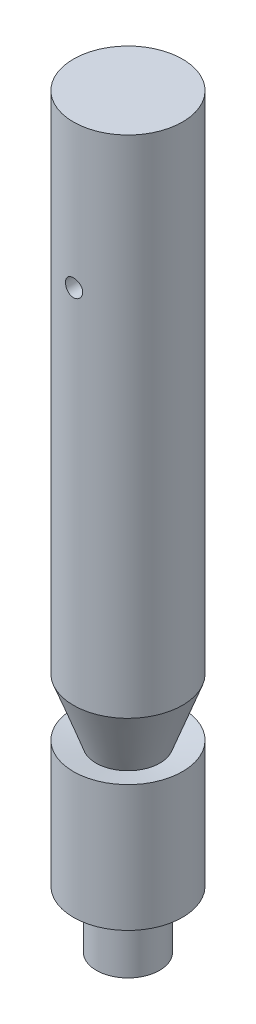
ISO-10303-21;
HEADER;
FILE_DESCRIPTION(('STEP AP214'),'2;1');
FILE_NAME('part.step','',(''),(''),'','','');
FILE_SCHEMA(('AUTOMOTIVE_DESIGN { 1 0 10303 214 1 1 1 1 }'));
ENDSEC;
DATA;
#1=APPLICATION_CONTEXT('core data for automotive mechanical design processes');
#2=APPLICATION_PROTOCOL_DEFINITION('international standard','automotive_design',2000,#1);
#3=PRODUCT_CONTEXT('',#1,'mechanical');
#4=PRODUCT('Part','Part','',(#3));
#5=PRODUCT_RELATED_PRODUCT_CATEGORY('part','',(#4));
#6=PRODUCT_DEFINITION_FORMATION('','',#4);
#7=PRODUCT_DEFINITION_CONTEXT('part definition',#1,'design');
#8=PRODUCT_DEFINITION('design','',#6,#7);
#9=PRODUCT_DEFINITION_SHAPE('','',#8);
#10=(LENGTH_UNIT() NAMED_UNIT(*) SI_UNIT(.MILLI.,.METRE.));
#11=(NAMED_UNIT(*) PLANE_ANGLE_UNIT() SI_UNIT($,.RADIAN.));
#12=(NAMED_UNIT(*) SI_UNIT($,.STERADIAN.) SOLID_ANGLE_UNIT());
#13=UNCERTAINTY_MEASURE_WITH_UNIT(LENGTH_MEASURE(1.E-05),#10,'distance_accuracy_value','');
#14=(GEOMETRIC_REPRESENTATION_CONTEXT(3) GLOBAL_UNCERTAINTY_ASSIGNED_CONTEXT((#13)) GLOBAL_UNIT_ASSIGNED_CONTEXT((#10,
#11,#12)) REPRESENTATION_CONTEXT('',''));
#15=CARTESIAN_POINT('',(0.,0.,0.));
#16=DIRECTION('',(0.,0.,1.));
#17=DIRECTION('',(1.,0.,0.));
#18=AXIS2_PLACEMENT_3D('',#15,#16,#17);
#19=CARTESIAN_POINT('',(0.,120.,0.));
#20=DIRECTION('',(0.,-1.,0.));
#21=DIRECTION('',(0.,0.,-1.));
#22=AXIS2_PLACEMENT_3D('',#19,#20,#21);
#23=CYLINDRICAL_SURFACE('',#22,9.5);
#24=CARTESIAN_POINT('',(0.,32.,0.));
#25=DIRECTION('',(0.,1.,0.));
#26=DIRECTION('',(0.,0.,1.));
#27=AXIS2_PLACEMENT_3D('',#24,#25,#26);
#28=CIRCLE('',#27,9.5);
#29=CARTESIAN_POINT('',(0.,32.,9.5));
#30=VERTEX_POINT('',#29);
#31=EDGE_CURVE('E62',#30,#30,#28,.T.);
#32=ORIENTED_EDGE('',*,*,#31,.T.);
#33=EDGE_LOOP('',(#32));
#34=FACE_BOUND('',#33,.T.);
#35=CARTESIAN_POINT('',(0.,120.,0.));
#36=DIRECTION('',(0.,1.,0.));
#37=DIRECTION('',(0.,0.,1.));
#38=AXIS2_PLACEMENT_3D('',#35,#36,#37);
#39=CIRCLE('',#38,9.5);
#40=CARTESIAN_POINT('',(0.,120.,9.5));
#41=VERTEX_POINT('',#40);
#42=EDGE_CURVE('E48',#41,#41,#39,.T.);
#43=ORIENTED_EDGE('',*,*,#42,.F.);
#44=EDGE_LOOP('',(#43));
#45=FACE_BOUND('',#44,.T.);
#46=CARTESIAN_POINT('',(-1.5,95.,9.38083151964686));
#47=CARTESIAN_POINT('',(-1.49999658455056,94.916309730994,9.38083297404067));
#48=CARTESIAN_POINT('',(-1.49297223784084,94.8325722057604,9.38196360092028));
#49=CARTESIAN_POINT('',(-1.46507009131938,94.6674421963071,9.38636039550341));
#50=CARTESIAN_POINT('',(-1.44417911871311,94.5860520187702,9.38962859377943));
#51=CARTESIAN_POINT('',(-1.38918760267279,94.4280306268152,9.39792135372632));
#52=CARTESIAN_POINT('',(-1.35509761216466,94.3513956671386,9.40294451195283));
#53=CARTESIAN_POINT('',(-1.27470128030859,94.2049430897645,9.414179545352));
#54=CARTESIAN_POINT('',(-1.22839647880733,94.1351246142734,9.42039127066217));
#55=CARTESIAN_POINT('',(-1.12444713836387,94.0036587559128,9.43336503838525));
#56=CARTESIAN_POINT('',(-1.06671563821398,93.9420805156865,9.44013105201472));
#57=CARTESIAN_POINT('',(-0.941739545888727,93.8294429254274,9.45341567106039));
#58=CARTESIAN_POINT('',(-0.874494412511281,93.7783841742228,9.45993426237471));
#59=CARTESIAN_POINT('',(-0.731954548292167,93.6879777440354,9.47203134599669));
#60=CARTESIAN_POINT('',(-0.656618750818363,93.6486940570074,9.47760463238818));
#61=CARTESIAN_POINT('',(-0.500315336961975,93.5833638343747,9.48713906529767));
#62=CARTESIAN_POINT('',(-0.419348049999347,93.5573165252331,9.49110030602129));
#63=CARTESIAN_POINT('',(-0.254793214503934,93.5194089321868,9.49693629805995));
#64=CARTESIAN_POINT('',(-0.171232996932503,93.5074326731839,9.4988280968723));
#65=CARTESIAN_POINT('',(-0.00326909893889383,93.4976467905348,9.5003705446193));
#66=CARTESIAN_POINT('',(0.0811345294603275,93.499836298441,9.50002133094165));
#67=CARTESIAN_POINT('',(0.247597304848638,93.5182287718207,9.49713466336619));
#68=CARTESIAN_POINT('',(0.329670625893898,93.5343069477594,9.49461669627846));
#69=CARTESIAN_POINT('',(0.489939598315297,93.5798241916706,9.48769715323518));
#70=CARTESIAN_POINT('',(0.568135141212462,93.6092636331844,9.48329552461823));
#71=CARTESIAN_POINT('',(0.718803540216118,93.6807937561529,9.47306987014885));
#72=CARTESIAN_POINT('',(0.791251288178856,93.7229364571255,9.46724001448607));
#73=CARTESIAN_POINT('',(0.928093849593964,93.8186387835267,9.45480671150477));
#74=CARTESIAN_POINT('',(0.992488076174234,93.872199240216,9.44820320787719));
#75=CARTESIAN_POINT('',(1.1121320674923,93.989910476114,9.43487320037046));
#76=CARTESIAN_POINT('',(1.16727457805414,94.0541702627698,9.42814614020982));
#77=CARTESIAN_POINT('',(1.26601092962899,94.1910871241671,9.41539709463343));
#78=CARTESIAN_POINT('',(1.30960468415935,94.2637442617862,9.40937511449785));
#79=CARTESIAN_POINT('',(1.38402357522716,94.4155109464371,9.39871800561222));
#80=CARTESIAN_POINT('',(1.41483681797789,94.4946264221589,9.3940841698043));
#81=CARTESIAN_POINT('',(1.46270749784294,94.6569994205907,9.38675017598398));
#82=CARTESIAN_POINT('',(1.47976601505946,94.7402566175231,9.38404986614159));
#83=CARTESIAN_POINT('',(1.49949411042943,94.9075929556589,9.38091773533559));
#84=CARTESIAN_POINT('',(1.50231612080203,94.9916536912182,9.38046188392375));
#85=CARTESIAN_POINT('',(1.4938963689811,95.1590470589331,9.38180638869071));
#86=CARTESIAN_POINT('',(1.48265509215639,95.2423797161168,9.38360666700331));
#87=CARTESIAN_POINT('',(1.44655746438407,95.4054736693627,9.38923845197488));
#88=CARTESIAN_POINT('',(1.42177781446732,95.4852523717135,9.39305851175888));
#89=CARTESIAN_POINT('',(1.35938693205191,95.6395243407161,9.4022899197254));
#90=CARTESIAN_POINT('',(1.3217750034913,95.7140173203894,9.40770135422673));
#91=CARTESIAN_POINT('',(1.23442398163625,95.856284315317,9.41956203589073));
#92=CARTESIAN_POINT('',(1.18458667109844,95.9239973256054,9.42601953670219));
#93=CARTESIAN_POINT('',(1.07433532022963,96.0501534885926,9.43922022959442));
#94=CARTESIAN_POINT('',(1.01392061491124,96.10859605803,9.44596343961713));
#95=CARTESIAN_POINT('',(0.883556250112778,96.2151040379333,9.45905128553892));
#96=CARTESIAN_POINT('',(0.813523322567928,96.2630681337632,9.46539164279549));
#97=CARTESIAN_POINT('',(0.666305394879817,96.3465500312293,9.47689193046182));
#98=CARTESIAN_POINT('',(0.589120607345009,96.3820682027044,9.48205189594613));
#99=CARTESIAN_POINT('',(0.430099180755792,96.439490080176,9.49059133505206));
#100=CARTESIAN_POINT('',(0.348282544696109,96.4614480818955,9.49397790107198));
#101=CARTESIAN_POINT('',(0.18206554100052,96.4913016379704,9.49861883842448));
#102=CARTESIAN_POINT('',(0.0976653637496311,96.4991982260071,9.49987336648691));
#103=CARTESIAN_POINT('',(-0.0703424890561692,96.5006774861193,9.50010700904781));
#104=CARTESIAN_POINT('',(-0.153948809855684,96.4944147738016,9.49911070212592));
#105=CARTESIAN_POINT('',(-0.318903288593769,96.468086009826,9.49500446266303));
#106=CARTESIAN_POINT('',(-0.400251456141506,96.4480200169149,9.4918945391176));
#107=CARTESIAN_POINT('',(-0.558330315524416,96.3947112386408,9.48390902705529));
#108=CARTESIAN_POINT('',(-0.635065084473802,96.3614802910505,9.47903502511628));
#109=CARTESIAN_POINT('',(-0.781893871437123,96.2828017130742,9.46805518209959));
#110=CARTESIAN_POINT('',(-0.851987627392476,96.2373536008625,9.46194929244058));
#111=CARTESIAN_POINT('',(-0.984326499290176,96.1349767236385,9.44910438099924));
#112=CARTESIAN_POINT('',(-1.04648306132953,96.0779342156682,9.44235947063351));
#113=CARTESIAN_POINT('',(-1.16039729972464,95.9542269669354,9.42903896923987));
#114=CARTESIAN_POINT('',(-1.21215253557012,95.887559974227,9.42246341826432));
#115=CARTESIAN_POINT('',(-1.30409009743287,95.7460015685182,9.4101817273596));
#116=CARTESIAN_POINT('',(-1.34419772972857,95.671061150686,9.40448130469082));
#117=CARTESIAN_POINT('',(-1.41119529560835,95.5154502477483,9.39466254048804));
#118=CARTESIAN_POINT('',(-1.43809871074204,95.434785703743,9.39054258623338));
#119=CARTESIAN_POINT('',(-1.47193913254667,95.2948171282112,9.38528558640041));
#120=CARTESIAN_POINT('',(-1.48244550005068,95.2363700340157,9.38362436450214));
#121=CARTESIAN_POINT('',(-1.49647709113172,95.1186231993665,9.38139682399235));
#122=CARTESIAN_POINT('',(-1.50000242102603,95.0593234719117,9.38083048870633));
#123=CARTESIAN_POINT('',(-1.5,95.,9.38083151964686));
#124=B_SPLINE_CURVE_WITH_KNOTS('',3,(#46,#47,#48,#49,#50,#51,#52,#53,#54,#55,#56,#57,#58,#59,
#60,#61,#62,#63,#64,#65,#66,#67,#68,#69,#70,#71,#72,#73,#74,#75,#76,#77,#78,#79,#80,#81,#82,#83,
#84,#85,#86,#87,#88,#89,#90,#91,#92,#93,#94,#95,#96,#97,#98,#99,#100,#101,#102,#103,#104,#105,
#106,#107,#108,#109,#110,#111,#112,#113,#114,#115,#116,#117,#118,#119,#120,#121,#122,#123),
.UNSPECIFIED.,.T.,.F.,(4,2,2,2,2,2,2,2,2,2,2,2,2,2,2,2,2,2,2,2,2,2,2,2,2,2,2,2,2,2,2,2,2,2,2,2,
2,2,4),(0.,0.250853927262175,0.501946498416266,0.752838728320962,1.00369934487582,
1.2565480788977,1.50941120251429,1.76362459165416,2.01782312279828,2.26991148848838,
2.52198439977627,2.77181572176523,3.02165402872708,3.27252964579772,3.52342353390932,
3.77705047333307,4.03067931198403,4.2845436557137,4.53838806257512,4.78950866646252,
5.04062060361752,5.2903244117372,5.54004176670728,5.79183509438421,6.04364425767608,
6.29778980620822,6.5519278019965,6.80504150202871,7.05813659442522,7.3084813238685,
7.55882498785124,7.80894405482682,8.05907298755212,8.31178569360908,8.56455762574338,
8.81891644248641,9.07301501496296,9.25083440456607,9.42865108605879),.UNSPECIFIED.);
#125=CARTESIAN_POINT('',(-1.5,95.,9.38083151964686));
#126=VERTEX_POINT('',#125);
#127=EDGE_CURVE('E89',#126,#126,#124,.T.);
#128=ORIENTED_EDGE('',*,*,#127,.F.);
#129=EDGE_LOOP('',(#128));
#130=FACE_BOUND('',#129,.T.);
#131=CARTESIAN_POINT('',(0.,96.5,-9.5));
#132=CARTESIAN_POINT('',(0.0836976001065224,96.4999965907509,-9.49999861203618));
#133=CARTESIAN_POINT('',(0.167442437394017,96.4929710548972,-9.49888234231911));
#134=CARTESIAN_POINT('',(0.332587635211275,96.4650637565303,-9.49453678011783));
#135=CARTESIAN_POINT('',(0.413985694895262,96.4441688479285,-9.49130548294469));
#136=CARTESIAN_POINT('',(0.572023766729429,96.389165821503,-9.48309267200424));
#137=CARTESIAN_POINT('',(0.648667457404599,96.3550680706656,-9.47811253172856));
#138=CARTESIAN_POINT('',(0.795134710469113,96.2746534544615,-9.46695108120927));
#139=CARTESIAN_POINT('',(0.864959141108909,96.2283381474605,-9.46076992418342));
#140=CARTESIAN_POINT('',(0.996418466512019,96.1243781145002,-9.44783324384051));
#141=CARTESIAN_POINT('',(1.05798606000114,96.0666487812363,-9.44107365911176));
#142=CARTESIAN_POINT('',(1.17060304704613,95.9416815182941,-9.4277734333424));
#143=CARTESIAN_POINT('',(1.22165180906462,95.8744430181058,-9.42123280546741));
#144=CARTESIAN_POINT('',(1.31204764005016,95.7319091555305,-9.40907168619827));
#145=CARTESIAN_POINT('',(1.3513289242466,95.6565715852408,-9.40345644380092));
#146=CARTESIAN_POINT('',(1.41665421811941,95.500264325212,-9.39383775862891));
#147=CARTESIAN_POINT('',(1.44269902834657,95.4192949764235,-9.38983421838048));
#148=CARTESIAN_POINT('',(1.4806016253586,95.2547330510483,-9.38393240557449));
#149=CARTESIAN_POINT('',(1.49257509267669,95.1711677452164,-9.38201697623701));
#150=CARTESIAN_POINT('',(1.50235362805524,95.0031938269418,-9.38045626095234));
#151=CARTESIAN_POINT('',(1.50015959652364,94.9187852684321,-9.38081083073655));
#152=CARTESIAN_POINT('',(1.48175980710843,94.7523420284438,-9.38373437383502));
#153=CARTESIAN_POINT('',(1.46568339888114,94.6702926367084,-9.38628290415411));
#154=CARTESIAN_POINT('',(1.4201779253579,94.5100706039259,-9.39327524902392));
#155=CARTESIAN_POINT('',(1.39074844516594,94.4318980834216,-9.39771912246498));
#156=CARTESIAN_POINT('',(1.3192392577636,94.2812581872508,-9.40802379337809));
#157=CARTESIAN_POINT('',(1.27710525865785,94.2088170156189,-9.41389065039576));
#158=CARTESIAN_POINT('',(1.1814216728908,94.0719839479095,-9.42637594353948));
#159=CARTESIAN_POINT('',(1.12787125747699,94.0075926367345,-9.43299443421261));
#160=CARTESIAN_POINT('',(1.01016734202821,93.8879378834007,-9.44632735425788));
#161=CARTESIAN_POINT('',(0.945902736525762,93.8327837045303,-9.45304203303564));
#162=CARTESIAN_POINT('',(0.808972007834449,93.7340260785717,-9.46574266984972));
#163=CARTESIAN_POINT('',(0.736305840302166,93.6904226924524,-9.47172862403949));
#164=CARTESIAN_POINT('',(0.584536306884608,93.6159967862499,-9.48230461469925));
#165=CARTESIAN_POINT('',(0.50542845812027,93.5851832593685,-9.48689366833474));
#166=CARTESIAN_POINT('',(0.343072096390926,93.5373096929979,-9.49415073946819));
#167=CARTESIAN_POINT('',(0.25982389441855,93.5202486221776,-9.49681890101704));
#168=CARTESIAN_POINT('',(0.0924923680310979,93.5005108630843,-9.49991434597553));
#169=CARTESIAN_POINT('',(0.00842716740137105,93.4976840615755,-9.50036501369999));
#170=CARTESIAN_POINT('',(-0.158976265712538,93.5060958248437,-9.49903852875433));
#171=CARTESIAN_POINT('',(-0.242314523112228,93.5173339056332,-9.4972614527432));
#172=CARTESIAN_POINT('',(-0.405439567370637,93.5534315813157,-9.49169362069365));
#173=CARTESIAN_POINT('',(-0.485243062795081,93.5782174955792,-9.48791376028194));
#174=CARTESIAN_POINT('',(-0.639561861197125,93.640629167573,-9.47876264558505));
#175=CARTESIAN_POINT('',(-0.714076892756963,93.6782555837364,-9.4733913096943));
#176=CARTESIAN_POINT('',(-0.85635993868238,93.7656284951105,-9.4615955819989));
#177=CARTESIAN_POINT('',(-0.924069207311133,93.8154695437873,-9.45516310943481));
#178=CARTESIAN_POINT('',(-1.05021609132263,93.9257260025891,-9.44198475905152));
#179=CARTESIAN_POINT('',(-1.10865310573566,93.9861420975892,-9.43523886095462));
#180=CARTESIAN_POINT('',(-1.21514760920432,94.1165042655629,-9.42211913600069));
#181=CARTESIAN_POINT('',(-1.26310409838576,94.186533313588,-9.41574932753235));
#182=CARTESIAN_POINT('',(-1.34657266649327,94.3337413122661,-9.40417594303638));
#183=CARTESIAN_POINT('',(-1.38208510941917,94.4109200537004,-9.39897233289797));
#184=CARTESIAN_POINT('',(-1.43950349612766,94.5699441109386,-9.39035010587673));
#185=CARTESIAN_POINT('',(-1.46146126125826,94.6517703311624,-9.38692469878068));
#186=CARTESIAN_POINT('',(-1.49131110199775,94.8180076672404,-9.38222912838246));
#187=CARTESIAN_POINT('',(-1.49920426388363,94.9024185829538,-9.38095879863367));
#188=CARTESIAN_POINT('',(-1.5006729373316,95.0704216729911,-9.38072387634563));
#189=CARTESIAN_POINT('',(-1.49440732883688,95.1540124655805,-9.38173369742789));
#190=CARTESIAN_POINT('',(-1.46807821019621,95.3189351330205,-9.38588947240367));
#191=CARTESIAN_POINT('',(-1.44801473210916,95.4002670131193,-9.38903542133398));
#192=CARTESIAN_POINT('',(-1.39471776903661,95.5583110648456,-9.39709967714348));
#193=CARTESIAN_POINT('',(-1.36149658069289,95.6350274730077,-9.40201632881049));
#194=CARTESIAN_POINT('',(-1.28284324745908,95.7818235683254,-9.41306982252277));
#195=CARTESIAN_POINT('',(-1.23741059974181,95.8519029820311,-9.41920671481075));
#196=CARTESIAN_POINT('',(-1.13505145080214,95.9842409680629,-9.4320909582884));
#197=CARTESIAN_POINT('',(-1.0780076272868,96.0464082415886,-9.43884411780419));
#198=CARTESIAN_POINT('',(-0.954293245344257,96.1603434805526,-9.45215249855795));
#199=CARTESIAN_POINT('',(-0.887620460616882,96.212109034385,-9.45870767359521));
#200=CARTESIAN_POINT('',(-0.746056649485082,96.3040585652105,-9.47092780190555));
#201=CARTESIAN_POINT('',(-0.671117681090887,96.3441694871727,-9.47658704267683));
#202=CARTESIAN_POINT('',(-0.515509688205495,96.4111735965458,-9.48632189921254));
#203=CARTESIAN_POINT('',(-0.434846589899651,96.4380802322673,-9.49039912533837));
#204=CARTESIAN_POINT('',(-0.294869549677876,96.4719290910522,-9.4955986667772));
#205=CARTESIAN_POINT('',(-0.23641196507141,96.4824392419162,-9.49724053176745));
#206=CARTESIAN_POINT('',(-0.118644158414185,96.4964758540843,-9.49944168248486));
#207=CARTESIAN_POINT('',(-0.059333948762981,96.500002416846,-9.50000098393949));
#208=CARTESIAN_POINT('',(0.,96.5,-9.5));
#209=B_SPLINE_CURVE_WITH_KNOTS('',3,(#131,#132,#133,#134,#135,#136,#137,#138,#139,#140,#141,
#142,#143,#144,#145,#146,#147,#148,#149,#150,#151,#152,#153,#154,#155,#156,#157,#158,#159,#160,
#161,#162,#163,#164,#165,#166,#167,#168,#169,#170,#171,#172,#173,#174,#175,#176,#177,#178,#179,
#180,#181,#182,#183,#184,#185,#186,#187,#188,#189,#190,#191,#192,#193,#194,#195,#196,#197,#198,
#199,#200,#201,#202,#203,#204,#205,#206,#207,#208),.UNSPECIFIED.,.T.,.F.,(4,2,2,2,2,2,2,2,2,2,2,
2,2,2,2,2,2,2,2,2,2,2,2,2,2,2,2,2,2,2,2,2,2,2,2,2,2,2,4),(0.,0.250875955706271,
0.501990044469084,0.752907354824662,1.00379267580463,1.25661257446513,1.50944764769345,
1.76367086508288,2.01787870505212,2.26998174901986,2.52206877086913,2.77183199835412,
3.02160298681438,3.27245685757923,3.52332894479686,3.77698595667627,4.03064430741767,
4.28448071735229,4.53829808968868,4.78943303847653,5.04055934568621,5.29033328489281,
5.54012003389347,5.79190509693549,6.04370647245535,6.29783677445573,6.55195964228959,
6.8051048478196,7.05823050087971,7.30852987505235,7.55882866766465,7.8088940914468,
8.0589698136668,8.31171040651355,8.56450952903009,8.81886068521235,9.07295224922779,
9.25080295634069,9.42865107961777),.UNSPECIFIED.);
#210=CARTESIAN_POINT('',(0.,96.5,-9.5));
#211=VERTEX_POINT('',#210);
#212=EDGE_CURVE('E94',#211,#211,#209,.T.);
#213=ORIENTED_EDGE('',*,*,#212,.F.);
#214=EDGE_LOOP('',(#213));
#215=FACE_BOUND('',#214,.T.);
#216=ADVANCED_FACE('F35',(#34,#45,#130,#215),#23,.T.);
#217=CARTESIAN_POINT('',(0.,100.,0.));
#218=DIRECTION('',(0.,-1.,0.));
#219=DIRECTION('',(0.,0.,-1.));
#220=AXIS2_PLACEMENT_3D('',#217,#218,#219);
#221=CYLINDRICAL_SURFACE('',#220,2.5);
#222=CARTESIAN_POINT('',(0.,100.,0.));
#223=DIRECTION('',(0.,-1.,0.));
#224=DIRECTION('',(0.,0.,-1.));
#225=AXIS2_PLACEMENT_3D('',#222,#223,#224);
#226=CIRCLE('',#225,2.5);
#227=CARTESIAN_POINT('',(0.,100.,-2.5));
#228=VERTEX_POINT('',#227);
#229=EDGE_CURVE('E101',#228,#228,#226,.T.);
#230=ORIENTED_EDGE('',*,*,#229,.F.);
#231=EDGE_LOOP('',(#230));
#232=FACE_BOUND('',#231,.T.);
#233=CARTESIAN_POINT('',(0.,-10.,0.));
#234=DIRECTION('',(0.,-1.,0.));
#235=DIRECTION('',(0.,0.,-1.));
#236=AXIS2_PLACEMENT_3D('',#233,#234,#235);
#237=CIRCLE('',#236,2.5);
#238=CARTESIAN_POINT('',(0.,-10.,-2.5));
#239=VERTEX_POINT('',#238);
#240=EDGE_CURVE('E100',#239,#239,#237,.T.);
#241=ORIENTED_EDGE('',*,*,#240,.T.);
#242=EDGE_LOOP('',(#241));
#243=FACE_BOUND('',#242,.T.);
#244=CARTESIAN_POINT('',(-1.5,95.,1.99999999999997));
#245=CARTESIAN_POINT('',(-1.50000404108592,95.0754789752896,1.99999416642509));
#246=CARTESIAN_POINT('',(-1.49426852824014,95.1509384340798,2.00433633903481));
#247=CARTESIAN_POINT('',(-1.47174965152788,95.2993239039622,2.02092590613883));
#248=CARTESIAN_POINT('',(-1.45495475788936,95.3722471873851,2.03318155043097));
#249=CARTESIAN_POINT('',(-1.41143486335796,95.5130836416773,2.06362339034729));
#250=CARTESIAN_POINT('',(-1.3847815450315,95.5810288380353,2.08176666183119));
#251=CARTESIAN_POINT('',(-1.32252909283019,95.7114374533679,2.12185904995836));
#252=CARTESIAN_POINT('',(-1.28692729054693,95.7738992296951,2.14380930122416));
#253=CARTESIAN_POINT('',(-1.20271292747644,95.8999490166641,2.19228594587542));
#254=CARTESIAN_POINT('',(-1.15304179435288,95.9627409571239,2.21904371037662));
#255=CARTESIAN_POINT('',(-1.04426801309984,96.0797647627418,2.27226229431061));
#256=CARTESIAN_POINT('',(-0.985158296729614,96.1339901516708,2.29872287517103));
#257=CARTESIAN_POINT('',(-0.851442367411704,96.2381338097097,2.35175567858734));
#258=CARTESIAN_POINT('',(-0.775851995162548,96.2869544636697,2.37803133577818));
#259=CARTESIAN_POINT('',(-0.615654228271656,96.3708097224444,2.42443786983179));
#260=CARTESIAN_POINT('',(-0.531055196626328,96.4058569741227,2.44457437988735));
#261=CARTESIAN_POINT('',(-0.363771406742664,96.4575959228127,2.4747098780044));
#262=CARTESIAN_POINT('',(-0.281674698130913,96.4757203609673,2.4854930393917));
#263=CARTESIAN_POINT('',(-0.114970509382706,96.4979428028631,2.49874939277545));
#264=CARTESIAN_POINT('',(-0.0303654624001519,96.5020539780001,2.50123038813307));
#265=CARTESIAN_POINT('',(0.127637283737311,96.4963862526575,2.49783372711539));
#266=CARTESIAN_POINT('',(0.201123832865636,96.4882664738307,2.49295437513726));
#267=CARTESIAN_POINT('',(0.345464269151769,96.4615202043519,2.47707997553857));
#268=CARTESIAN_POINT('',(0.416317961051202,96.4428929360928,2.46608447529309));
#269=CARTESIAN_POINT('',(0.554056780469078,96.3958344372962,2.43884907201719));
#270=CARTESIAN_POINT('',(0.620916491037614,96.367346938861,2.42257910450824));
#271=CARTESIAN_POINT('',(0.748988660115605,96.3016153837745,2.38609637638748));
#272=CARTESIAN_POINT('',(0.810199646208005,96.264369052941,2.36588259201812));
#273=CARTESIAN_POINT('',(0.933074267143196,96.1771609071956,2.32037925976363));
#274=CARTESIAN_POINT('',(0.993918663198192,96.1262116882643,2.2947718295215));
#275=CARTESIAN_POINT('',(1.10671465909274,96.0155958821398,2.24255554245601));
#276=CARTESIAN_POINT('',(1.15865401308339,95.9559174965255,2.21594536703375));
#277=CARTESIAN_POINT('',(1.25824837767416,95.8213465938365,2.16111075123946));
#278=CARTESIAN_POINT('',(1.30470933188631,95.7454924234606,2.13305661385125));
#279=CARTESIAN_POINT('',(1.38397217194231,95.5852937683634,2.08250879557268));
#280=CARTESIAN_POINT('',(1.41679921962188,95.5009652838744,2.06000490298821));
#281=CARTESIAN_POINT('',(1.46077497064842,95.3476063681047,2.02895865196732));
#282=CARTESIAN_POINT('',(1.47527903312664,95.2799593677034,2.01833888618316));
#283=CARTESIAN_POINT('',(1.49480872755284,95.1426263897005,2.00392150777558));
#284=CARTESIAN_POINT('',(1.49984538302907,95.0729428795155,2.00011596115116));
#285=CARTESIAN_POINT('',(1.50014781114183,94.9334483175643,1.99988914321323));
#286=CARTESIAN_POINT('',(1.49540004697659,94.8636372227848,2.00347810223984));
#287=CARTESIAN_POINT('',(1.47640290574941,94.7260126562514,2.01751520788652));
#288=CARTESIAN_POINT('',(1.46214601830139,94.6582008077597,2.02796877613213));
#289=CARTESIAN_POINT('',(1.42488312618657,94.5262854205202,2.054317683331));
#290=CARTESIAN_POINT('',(1.40188805257362,94.4621773634678,2.07020622092812));
#291=CARTESIAN_POINT('',(1.34796261057072,94.3385222842698,2.10571539417587));
#292=CARTESIAN_POINT('',(1.31702924888212,94.278976993634,2.12533743689999));
#293=CARTESIAN_POINT('',(1.24167439558512,94.1547599174878,2.17036819177737));
#294=CARTESIAN_POINT('',(1.19582663060302,94.0910991649034,2.19618239397369));
#295=CARTESIAN_POINT('',(1.094873955187,93.9717145151505,2.24821754803621));
#296=CARTESIAN_POINT('',(1.03976018672401,93.9159983078309,2.27443886711455));
#297=CARTESIAN_POINT('',(0.913274837212756,93.8067759926496,2.32835625910914));
#298=CARTESIAN_POINT('',(0.840721108780182,93.7544992733942,2.3558007587587));
#299=CARTESIAN_POINT('',(0.686103100868012,93.6630972231633,2.40537639133459));
#300=CARTESIAN_POINT('',(0.604045176134693,93.6239631721591,2.42751104449411));
#301=CARTESIAN_POINT('',(0.438840232972128,93.5631317965686,2.46252280092775));
#302=CARTESIAN_POINT('',(0.356205963651249,93.5403737722089,2.47595588067329));
#303=CARTESIAN_POINT('',(0.187383063890849,93.5092853971537,2.494407389061));
#304=CARTESIAN_POINT('',(0.101198571781961,93.5009387092824,2.49943534582737));
#305=CARTESIAN_POINT('',(-0.0598120232009904,93.4993253914141,2.50040600461976));
#306=CARTESIAN_POINT('',(-0.134620583589712,93.504196665437,2.49747057186327));
#307=CARTESIAN_POINT('',(-0.282148755978779,93.5248938243816,2.48512948412095));
#308=CARTESIAN_POINT('',(-0.35486834470192,93.5407198313216,2.47572375706639));
#309=CARTESIAN_POINT('',(-0.4951454819788,93.5822195715838,2.45149427526962));
#310=CARTESIAN_POINT('',(-0.562767032608831,93.6077315961292,2.43675966858906));
#311=CARTESIAN_POINT('',(-0.692781971999985,93.6676405945548,2.40303337447155));
#312=CARTESIAN_POINT('',(-0.755174184199835,93.7020395608596,2.38404073252268));
#313=CARTESIAN_POINT('',(-0.880263645295949,93.7829251965688,2.3409343265938));
#314=CARTESIAN_POINT('',(-0.942258690439939,93.8303187090169,2.31648844639149));
#315=CARTESIAN_POINT('',(-1.05789751536306,93.9337530337177,2.26601907350661));
#316=CARTESIAN_POINT('',(-1.11153190956916,93.9898034256079,2.23999385274509));
#317=CARTESIAN_POINT('',(-1.2159097535057,94.1172855621777,2.18528165666204));
#318=CARTESIAN_POINT('',(-1.26542406663368,94.1897664861655,2.15667566270901));
#319=CARTESIAN_POINT('',(-1.35156817210325,94.3434848527665,2.10376464485145));
#320=CARTESIAN_POINT('',(-1.38820466322661,94.4247177139814,2.07945738811052));
#321=CARTESIAN_POINT('',(-1.44437116535132,94.5870642851372,2.0408000304796));
#322=CARTESIAN_POINT('',(-1.46509526060187,94.6675952359612,2.02577665830139));
#323=CARTESIAN_POINT('',(-1.49289268240426,94.8320973947037,2.00539032320035));
#324=CARTESIAN_POINT('',(-1.49999550595837,94.9160607657587,2.0000064874464));
#325=CARTESIAN_POINT('',(-1.5,95.,1.99999999999997));
#326=B_SPLINE_CURVE_WITH_KNOTS('',3,(#244,#245,#246,#247,#248,#249,#250,#251,#252,#253,#254,
#255,#256,#257,#258,#259,#260,#261,#262,#263,#264,#265,#266,#267,#268,#269,#270,#271,#272,#273,
#274,#275,#276,#277,#278,#279,#280,#281,#282,#283,#284,#285,#286,#287,#288,#289,#290,#291,#292,
#293,#294,#295,#296,#297,#298,#299,#300,#301,#302,#303,#304,#305,#306,#307,#308,#309,#310,#311,
#312,#313,#314,#315,#316,#317,#318,#319,#320,#321,#322,#323,#324,#325),.UNSPECIFIED.,.T.,.F.,(4,
2,2,2,2,2,2,2,2,2,2,2,2,2,2,2,2,2,2,2,2,2,2,2,2,2,2,2,2,2,2,2,2,2,2,2,2,2,2,2,4),(0.,
0.226085249493378,0.452406574330772,0.677113624991867,0.90188776221594,1.15414462390002,
1.40659128601844,1.68630157736223,1.96575443271221,2.21853330858498,2.47107452602767,
2.69230130543182,2.91354445887944,3.13607155036377,3.35865648368878,3.60782810055849,
3.85733966656907,4.13576671140273,4.41367760154768,4.6227629805468,4.83160475643977,
5.04073566011182,5.2500319330413,5.45906724365496,5.66818149154662,5.91499438482003,
6.16204457978457,6.4412182801159,6.72020638384849,6.97891479383339,7.23732973022727,
7.461293218494,7.68525920139649,7.90563970188756,8.12606965394585,8.37042963549487,
8.61506198741955,8.89071695766605,9.16622832484806,9.41820120134354,9.66962780912278),.UNSPECIFIED.);
#327=CARTESIAN_POINT('',(-1.5,95.,1.99999999999997));
#328=VERTEX_POINT('',#327);
#329=EDGE_CURVE('E69',#328,#328,#326,.T.);
#330=ORIENTED_EDGE('',*,*,#329,.F.);
#331=EDGE_LOOP('',(#330));
#332=FACE_BOUND('',#331,.T.);
#333=CARTESIAN_POINT('',(0.,96.5,-2.5));
#334=CARTESIAN_POINT('',(-0.0767298334620164,96.4999959089901,-2.49999625789732));
#335=CARTESIAN_POINT('',(-0.15358232064418,96.4940713290737,-2.4964290461501));
#336=CARTESIAN_POINT('',(-0.304975509530681,96.4706756804847,-2.48249903608568));
#337=CARTESIAN_POINT('',(-0.379510034596049,96.4531761381458,-2.47211948032719));
#338=CARTESIAN_POINT('',(-0.523751827790839,96.4076136388331,-2.44561558054488));
#339=CARTESIAN_POINT('',(-0.59348102822657,96.3796030418368,-2.42951973272944));
#340=CARTESIAN_POINT('',(-0.727030318214664,96.314139666859,-2.39295367626407));
#341=CARTESIAN_POINT('',(-0.790851869416389,96.2766892330313,-2.37248455380255));
#342=CARTESIAN_POINT('',(-0.91629927899932,96.1902251732914,-2.32705360719087));
#343=CARTESIAN_POINT('',(-0.977384020081419,96.1405463046486,-2.30186792195985));
#344=CARTESIAN_POINT('',(-1.09088270411891,96.0325327961717,-2.25030439279633));
#345=CARTESIAN_POINT('',(-1.14328534948113,95.9741870628127,-2.2239250515357));
#346=CARTESIAN_POINT('',(-1.24444996762975,95.8420764895033,-2.1691106699591));
#347=CARTESIAN_POINT('',(-1.29197766378809,95.7672982290187,-2.14082017703649));
#348=CARTESIAN_POINT('',(-1.37361437764897,95.6091534267569,-2.08938301412124));
#349=CARTESIAN_POINT('',(-1.4077451733516,95.5258011037524,-2.06622802273937));
#350=CARTESIAN_POINT('',(-1.45440601714222,95.3734035493468,-2.0335462966093));
#351=CARTESIAN_POINT('',(-1.47016197246826,95.3057640013897,-2.02207883137591));
#352=CARTESIAN_POINT('',(-1.49216172340475,95.1681962841696,-2.00590308295503));
#353=CARTESIAN_POINT('',(-1.49841734556836,95.0982710712455,-2.00118639643759));
#354=CARTESIAN_POINT('',(-1.50105508796009,94.9579885057827,-1.99920922463856));
#355=CARTESIAN_POINT('',(-1.49741783408419,94.8876305749068,-2.00196337012718));
#356=CARTESIAN_POINT('',(-1.48046060478828,94.7487212245724,-2.01453261443741));
#357=CARTESIAN_POINT('',(-1.46713334620103,94.6801712041526,-2.02435302432225));
#358=CARTESIAN_POINT('',(-1.43173921881793,94.5474697578719,-2.04953186944258));
#359=CARTESIAN_POINT('',(-1.40978748666088,94.4832729460755,-2.06481711652537));
#360=CARTESIAN_POINT('',(-1.35795061770838,94.3593050090719,-2.09927051350828));
#361=CARTESIAN_POINT('',(-1.32806257259706,94.2995355165761,-2.11844008623464));
#362=CARTESIAN_POINT('',(-1.25517983184585,94.1750159028772,-2.16255327268984));
#363=CARTESIAN_POINT('',(-1.21080724397725,94.1112219070451,-2.18792043372991));
#364=CARTESIAN_POINT('',(-1.11291092784006,93.991323516333,-2.2393059976438));
#365=CARTESIAN_POINT('',(-1.05937845100582,93.9352265660235,-2.26532500262148));
#366=CARTESIAN_POINT('',(-0.935811834382999,93.8243870181783,-2.31935504958315));
#367=CARTESIAN_POINT('',(-0.86451768270499,93.770922693984,-2.34713836268531));
#368=CARTESIAN_POINT('',(-0.712276050459033,93.6768779528021,-2.3977242843398));
#369=CARTESIAN_POINT('',(-0.631333763943597,93.6362906462101,-2.42052955425514));
#370=CARTESIAN_POINT('',(-0.467197585268238,93.5720678172041,-2.45730392066151));
#371=CARTESIAN_POINT('',(-0.384467624173611,93.5475246442841,-2.47173957439703));
#372=CARTESIAN_POINT('',(-0.21504789514467,93.5129888025946,-2.4921884281355));
#373=CARTESIAN_POINT('',(-0.12836300566135,93.5029786822464,-2.49821172952738));
#374=CARTESIAN_POINT('',(0.033714614377366,93.4984921523217,-2.5009057037461));
#375=CARTESIAN_POINT('',(0.109042473418688,93.5020911449148,-2.49873521714286));
#376=CARTESIAN_POINT('',(0.257829401986034,93.5204258530719,-2.48778712087049));
#377=CARTESIAN_POINT('',(0.331288509376082,93.5351613428058,-2.47900964518038));
#378=CARTESIAN_POINT('',(0.47257493215759,93.5745434328124,-2.45594792442191));
#379=CARTESIAN_POINT('',(0.540495750928459,93.5989403490735,-2.44180275662556));
#380=CARTESIAN_POINT('',(0.67126574908724,93.6566773763653,-2.40913880862845));
#381=CARTESIAN_POINT('',(0.73411392496389,93.6900192513467,-2.39061916586512));
#382=CARTESIAN_POINT('',(0.860006262823848,93.7685569792087,-2.34845496237361));
#383=CARTESIAN_POINT('',(0.922394150456821,93.8146238290784,-2.3244780273988));
#384=CARTESIAN_POINT('',(1.03902603131012,93.9153913934886,-2.27474265574732));
#385=CARTESIAN_POINT('',(1.09326040273736,93.9701021548525,-2.24898216586361));
#386=CARTESIAN_POINT('',(1.19931996735578,94.0949103900371,-2.19445423909892));
#387=CARTESIAN_POINT('',(1.24991019630914,94.1660838854655,-2.16573241746292));
#388=CARTESIAN_POINT('',(1.33845238915667,94.3172160245682,-2.1121618206671));
#389=CARTESIAN_POINT('',(1.3764176676978,94.3971652938928,-2.0873089799769));
#390=CARTESIAN_POINT('',(1.43142578795776,94.5462430223067,-2.0498490924052));
#391=CARTESIAN_POINT('',(1.4512162533619,94.6139803123586,-2.03575659328729));
#392=CARTESIAN_POINT('',(1.48113663905971,94.7525320780801,-2.01409605743544));
#393=CARTESIAN_POINT('',(1.4912799529763,94.8233421443278,-2.00651897642721));
#394=CARTESIAN_POINT('',(1.50134130416631,94.966376947597,-1.99900446616267));
#395=CARTESIAN_POINT('',(1.50122089107869,95.038605990687,-1.99909576445937));
#396=CARTESIAN_POINT('',(1.49066472959328,95.1818944356094,-2.0069771789285));
#397=CARTESIAN_POINT('',(1.48022337215759,95.2529531800806,-2.0147714813882));
#398=CARTESIAN_POINT('',(1.45040174148914,95.3884884175721,-2.03633185242979));
#399=CARTESIAN_POINT('',(1.43147636845352,95.4531170943068,-2.0497921180558));
#400=CARTESIAN_POINT('',(1.38563242076995,95.5783372544742,-2.08105501960151));
#401=CARTESIAN_POINT('',(1.35871083588481,95.6389272069605,-2.09885929040481));
#402=CARTESIAN_POINT('',(1.29289245555735,95.7643198572208,-2.14012990550915));
#403=CARTESIAN_POINT('',(1.25279167675755,95.8283411038543,-2.16404587582638));
#404=CARTESIAN_POINT('',(1.16375698389087,95.9493800726173,-2.21320127030766));
#405=CARTESIAN_POINT('',(1.11481579607801,96.0063919621525,-2.2384417720502));
#406=CARTESIAN_POINT('',(1.00009777425738,96.1213509491316,-2.29225690291475));
#407=CARTESIAN_POINT('',(0.932876819313942,96.1779310748962,-2.32070308663656));
#408=CARTESIAN_POINT('',(0.788462434445628,96.2790978558633,-2.37365428872366));
#409=CARTESIAN_POINT('',(0.711265444501577,96.3236802119848,-2.39815789310935));
#410=CARTESIAN_POINT('',(0.551125230801493,96.3977858075737,-2.43985578654393));
#411=CARTESIAN_POINT('',(0.468430086957257,96.4277280649268,-2.45725077479786));
#412=CARTESIAN_POINT('',(0.297973306118854,96.472724695211,-2.48366273001245));
#413=CARTESIAN_POINT('',(0.210232099648659,96.487835167857,-2.49271125871485));
#414=CARTESIAN_POINT('',(0.101558096917574,96.4966974547087,-2.49802001168186));
#415=CARTESIAN_POINT('',(0.081276259028308,96.4979344173061,-2.49876114656362));
#416=CARTESIAN_POINT('',(0.0406658206871277,96.4995862463709,-2.49975164517367));
#417=CARTESIAN_POINT('',(0.0203372186375771,96.5000010843209,-2.50000099184316));
#418=CARTESIAN_POINT('',(0.,96.5,-2.5));
#419=B_SPLINE_CURVE_WITH_KNOTS('',3,(#333,#334,#335,#336,#337,#338,#339,#340,#341,#342,#343,
#344,#345,#346,#347,#348,#349,#350,#351,#352,#353,#354,#355,#356,#357,#358,#359,#360,#361,#362,
#363,#364,#365,#366,#367,#368,#369,#370,#371,#372,#373,#374,#375,#376,#377,#378,#379,#380,#381,
#382,#383,#384,#385,#386,#387,#388,#389,#390,#391,#392,#393,#394,#395,#396,#397,#398,#399,#400,
#401,#402,#403,#404,#405,#406,#407,#408,#409,#410,#411,#412,#413,#414,#415,#416,#417,#418),
.UNSPECIFIED.,.T.,.F.,(4,2,2,2,2,2,2,2,2,2,2,2,2,2,2,2,2,2,2,2,2,2,2,2,2,2,2,2,2,2,2,2,2,2,2,2,
2,2,2,2,2,2,4),(0.,0.230102237548651,0.460772627520017,0.690308884600014,0.919788197992282,
1.16681590732473,1.41416257934801,1.69183813189808,1.96906040692092,2.17933829855632,
2.38935420916577,2.59978170870724,2.81036753273871,3.01823267593204,3.22617409809864,
3.47046995225159,3.7150004480367,3.99360957884687,4.27206939275321,4.53296790696557,
4.79355286918233,5.01875602722424,5.24395461863453,5.46367785689769,5.68344445659023,
5.92601365818359,6.16886690081834,6.44336762428008,6.71757792616454,6.9325778731469,
7.14727888733316,7.3627842577743,7.57840681155722,7.78364098331139,7.98895251523032,
8.22578610052282,8.46281544370203,8.73854311775515,9.01436946031981,9.28175654462672,
9.54812832184444,9.60911473335175,9.67010326027641),.UNSPECIFIED.);
#420=CARTESIAN_POINT('',(0.,96.5,-2.5));
#421=VERTEX_POINT('',#420);
#422=EDGE_CURVE('E39',#421,#421,#419,.T.);
#423=ORIENTED_EDGE('',*,*,#422,.F.);
#424=EDGE_LOOP('',(#423));
#425=FACE_BOUND('',#424,.T.);
#426=ADVANCED_FACE('F74',(#232,#243,#332,#425),#221,.F.);
#427=CARTESIAN_POINT('',(0.,22.,0.));
#428=DIRECTION('',(0.,1.,0.));
#429=DIRECTION('',(0.,0.,1.));
#430=AXIS2_PLACEMENT_3D('',#427,#428,#429);
#431=CIRCLE('',#430,9.5);
#432=CARTESIAN_POINT('',(0.,22.,9.5));
#433=VERTEX_POINT('',#432);
#434=EDGE_CURVE('E65',#433,#433,#431,.T.);
#435=ORIENTED_EDGE('',*,*,#434,.F.);
#436=EDGE_LOOP('',(#435));
#437=FACE_BOUND('',#436,.T.);
#438=CARTESIAN_POINT('',(0.,0.,0.));
#439=DIRECTION('',(0.,1.,0.));
#440=DIRECTION('',(0.,0.,1.));
#441=AXIS2_PLACEMENT_3D('',#438,#439,#440);
#442=CIRCLE('',#441,9.5);
#443=CARTESIAN_POINT('',(0.,0.,9.5));
#444=VERTEX_POINT('',#443);
#445=EDGE_CURVE('E53',#444,#444,#442,.T.);
#446=ORIENTED_EDGE('',*,*,#445,.T.);
#447=EDGE_LOOP('',(#446));
#448=FACE_BOUND('',#447,.T.);
#449=ADVANCED_FACE('F128',(#437,#448),#23,.T.);
#450=CARTESIAN_POINT('',(0.,0.,0.));
#451=DIRECTION('',(0.,1.,0.));
#452=DIRECTION('',(0.,0.,1.));
#453=AXIS2_PLACEMENT_3D('',#450,#451,#452);
#454=PLANE('',#453);
#455=CARTESIAN_POINT('',(0.,0.,0.));
#456=DIRECTION('',(0.,-1.,0.));
#457=DIRECTION('',(0.,0.,-1.));
#458=AXIS2_PLACEMENT_3D('',#455,#456,#457);
#459=CIRCLE('',#458,5.5);
#460=CARTESIAN_POINT('',(0.,0.,-5.5));
#461=VERTEX_POINT('',#460);
#462=EDGE_CURVE('E10',#461,#461,#459,.T.);
#463=ORIENTED_EDGE('',*,*,#462,.F.);
#464=EDGE_LOOP('',(#463));
#465=FACE_BOUND('',#464,.T.);
#466=ORIENTED_EDGE('',*,*,#445,.F.);
#467=EDGE_LOOP('',(#466));
#468=FACE_BOUND('',#467,.T.);
#469=ADVANCED_FACE('F137',(#465,#468),#454,.F.);
#470=CARTESIAN_POINT('',(0.,22.,0.));
#471=DIRECTION('',(0.,1.,0.));
#472=DIRECTION('',(0.,0.,1.));
#473=AXIS2_PLACEMENT_3D('',#470,#471,#472);
#474=CONICAL_SURFACE('',#473,9.5,1.39626340159547);
#475=CARTESIAN_POINT('',(0.,21.3054072893323,0.));
#476=DIRECTION('',(0.,1.,0.));
#477=DIRECTION('',(0.,0.,1.));
#478=AXIS2_PLACEMENT_3D('',#475,#476,#477);
#479=CIRCLE('',#478,5.56076898795116);
#480=CARTESIAN_POINT('',(0.,21.3054072893323,5.56076898795116));
#481=VERTEX_POINT('',#480);
#482=EDGE_CURVE('E59',#481,#481,#479,.T.);
#483=ORIENTED_EDGE('',*,*,#482,.F.);
#484=EDGE_LOOP('',(#483));
#485=FACE_BOUND('',#484,.T.);
#486=ORIENTED_EDGE('',*,*,#434,.T.);
#487=EDGE_LOOP('',(#486));
#488=FACE_BOUND('',#487,.T.);
#489=ADVANCED_FACE('F144',(#485,#488),#474,.F.);
#490=CARTESIAN_POINT('',(0.,21.3054072893323,0.));
#491=DIRECTION('',(0.,1.,0.));
#492=DIRECTION('',(0.,0.,1.));
#493=AXIS2_PLACEMENT_3D('',#490,#491,#492);
#494=CONICAL_SURFACE('',#493,5.56076898795116,0.352917763095426);
#495=ORIENTED_EDGE('',*,*,#31,.F.);
#496=EDGE_LOOP('',(#495));
#497=FACE_BOUND('',#496,.T.);
#498=ORIENTED_EDGE('',*,*,#482,.T.);
#499=EDGE_LOOP('',(#498));
#500=FACE_BOUND('',#499,.T.);
#501=ADVANCED_FACE('F122',(#497,#500),#494,.T.);
#502=CARTESIAN_POINT('',(0.,120.,0.));
#503=DIRECTION('',(0.,1.,0.));
#504=DIRECTION('',(0.,0.,1.));
#505=AXIS2_PLACEMENT_3D('',#502,#503,#504);
#506=PLANE('',#505);
#507=ORIENTED_EDGE('',*,*,#42,.T.);
#508=EDGE_LOOP('',(#507));
#509=FACE_BOUND('',#508,.T.);
#510=ADVANCED_FACE('F116',(#509),#506,.T.);
#511=CARTESIAN_POINT('',(0.,-10.,0.));
#512=DIRECTION('',(0.,1.,0.));
#513=DIRECTION('',(0.,0.,1.));
#514=AXIS2_PLACEMENT_3D('',#511,#512,#513);
#515=CYLINDRICAL_SURFACE('',#514,5.5);
#516=CARTESIAN_POINT('',(0.,-10.,0.));
#517=DIRECTION('',(0.,-1.,0.));
#518=DIRECTION('',(0.,0.,-1.));
#519=AXIS2_PLACEMENT_3D('',#516,#517,#518);
#520=CIRCLE('',#519,5.5);
#521=CARTESIAN_POINT('',(0.,-10.,-5.5));
#522=VERTEX_POINT('',#521);
#523=EDGE_CURVE('E57',#522,#522,#520,.T.);
#524=ORIENTED_EDGE('',*,*,#523,.F.);
#525=EDGE_LOOP('',(#524));
#526=FACE_BOUND('',#525,.T.);
#527=ORIENTED_EDGE('',*,*,#462,.T.);
#528=EDGE_LOOP('',(#527));
#529=FACE_BOUND('',#528,.T.);
#530=ADVANCED_FACE('F111',(#526,#529),#515,.T.);
#531=CARTESIAN_POINT('',(0.,-10.,0.));
#532=DIRECTION('',(0.,-1.,0.));
#533=DIRECTION('',(0.,0.,-1.));
#534=AXIS2_PLACEMENT_3D('',#531,#532,#533);
#535=PLANE('',#534);
#536=ORIENTED_EDGE('',*,*,#240,.F.);
#537=EDGE_LOOP('',(#536));
#538=FACE_BOUND('',#537,.T.);
#539=ORIENTED_EDGE('',*,*,#523,.T.);
#540=EDGE_LOOP('',(#539));
#541=FACE_BOUND('',#540,.T.);
#542=ADVANCED_FACE('F108',(#538,#541),#535,.T.);
#543=CARTESIAN_POINT('',(0.,100.,0.));
#544=DIRECTION('',(0.,-1.,0.));
#545=DIRECTION('',(0.,0.,-1.));
#546=AXIS2_PLACEMENT_3D('',#543,#544,#545);
#547=PLANE('',#546);
#548=ORIENTED_EDGE('',*,*,#229,.T.);
#549=EDGE_LOOP('',(#548));
#550=FACE_BOUND('',#549,.T.);
#551=ADVANCED_FACE('F83',(#550),#547,.T.);
#552=CARTESIAN_POINT('',(0.,95.,110.));
#553=DIRECTION('',(0.,0.,-1.));
#554=DIRECTION('',(-1.,0.,0.));
#555=AXIS2_PLACEMENT_3D('',#552,#553,#554);
#556=CYLINDRICAL_SURFACE('',#555,1.5);
#557=ORIENTED_EDGE('',*,*,#329,.T.);
#558=EDGE_LOOP('',(#557));
#559=FACE_BOUND('',#558,.T.);
#560=ORIENTED_EDGE('',*,*,#127,.T.);
#561=EDGE_LOOP('',(#560));
#562=FACE_BOUND('',#561,.T.);
#563=ADVANCED_FACE('F81',(#559,#562),#556,.F.);
#564=ORIENTED_EDGE('',*,*,#422,.T.);
#565=EDGE_LOOP('',(#564));
#566=FACE_BOUND('',#565,.T.);
#567=ORIENTED_EDGE('',*,*,#212,.T.);
#568=EDGE_LOOP('',(#567));
#569=FACE_BOUND('',#568,.T.);
#570=ADVANCED_FACE('F78',(#566,#569),#556,.F.);
#571=CLOSED_SHELL('',(#216,#426,#449,#469,#489,#501,#510,#530,#542,#551,#563,#570));
#572=MANIFOLD_SOLID_BREP('B2',#571);
#573=ADVANCED_BREP_SHAPE_REPRESENTATION('',(#18,#572),#14);
#574=SHAPE_DEFINITION_REPRESENTATION(#9,#573);
ENDSEC;
END-ISO-10303-21;
